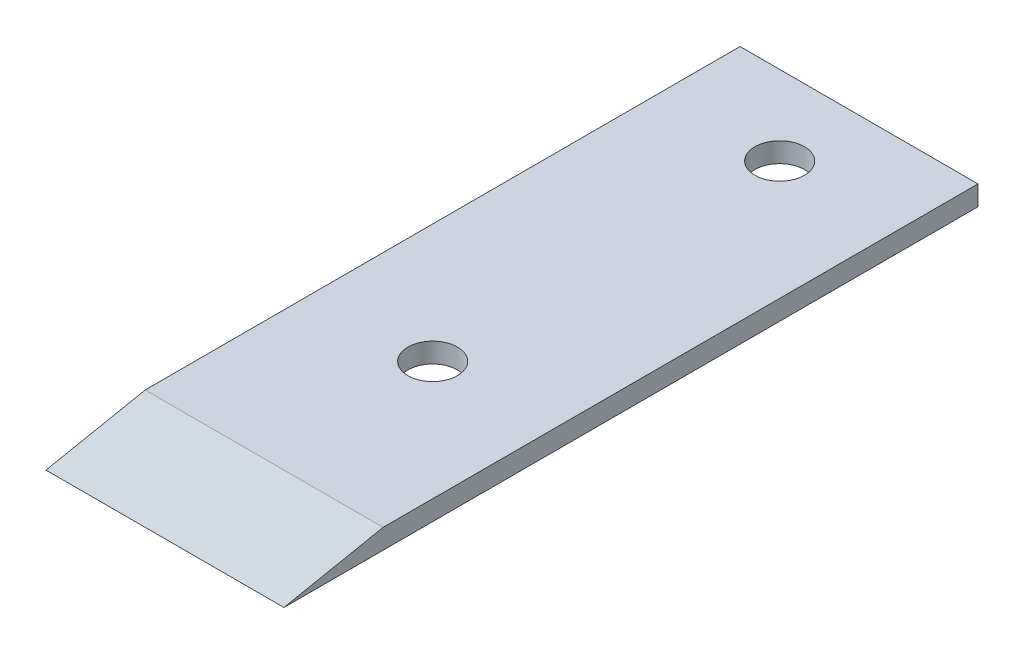
ISO-10303-21;
HEADER;
FILE_DESCRIPTION(('STEP AP214'),'2;1');
FILE_NAME('part.step','',(''),(''),'','','');
FILE_SCHEMA(('AUTOMOTIVE_DESIGN { 1 0 10303 214 1 1 1 1 }'));
ENDSEC;
DATA;
#1=APPLICATION_CONTEXT('core data for automotive mechanical design processes');
#2=APPLICATION_PROTOCOL_DEFINITION('international standard','automotive_design',2000,#1);
#3=PRODUCT_CONTEXT('',#1,'mechanical');
#4=PRODUCT('Part','Part','',(#3));
#5=PRODUCT_RELATED_PRODUCT_CATEGORY('part','',(#4));
#6=PRODUCT_DEFINITION_FORMATION('','',#4);
#7=PRODUCT_DEFINITION_CONTEXT('part definition',#1,'design');
#8=PRODUCT_DEFINITION('design','',#6,#7);
#9=PRODUCT_DEFINITION_SHAPE('','',#8);
#10=(LENGTH_UNIT() NAMED_UNIT(*) SI_UNIT(.MILLI.,.METRE.));
#11=(NAMED_UNIT(*) PLANE_ANGLE_UNIT() SI_UNIT($,.RADIAN.));
#12=(NAMED_UNIT(*) SI_UNIT($,.STERADIAN.) SOLID_ANGLE_UNIT());
#13=UNCERTAINTY_MEASURE_WITH_UNIT(LENGTH_MEASURE(1.E-05),#10,'distance_accuracy_value','');
#14=(GEOMETRIC_REPRESENTATION_CONTEXT(3) GLOBAL_UNCERTAINTY_ASSIGNED_CONTEXT((#13)) GLOBAL_UNIT_ASSIGNED_CONTEXT((#10,
#11,#12)) REPRESENTATION_CONTEXT('',''));
#15=CARTESIAN_POINT('',(0.,0.,0.));
#16=DIRECTION('',(0.,0.,1.));
#17=DIRECTION('',(1.,0.,0.));
#18=AXIS2_PLACEMENT_3D('',#15,#16,#17);
#19=CARTESIAN_POINT('',(0.,2.,0.));
#20=DIRECTION('',(0.,-1.,0.));
#21=DIRECTION('',(0.,0.,-1.));
#22=AXIS2_PLACEMENT_3D('',#19,#20,#21);
#23=PLANE('',#22);
#24=CARTESIAN_POINT('',(0.,2.,-27.));
#25=DIRECTION('',(0.,1.,0.));
#26=DIRECTION('',(0.,0.,1.));
#27=AXIS2_PLACEMENT_3D('',#24,#25,#26);
#28=CIRCLE('',#27,2.5);
#29=CARTESIAN_POINT('',(0.,2.,-24.5));
#30=VERTEX_POINT('',#29);
#31=EDGE_CURVE('E121',#30,#30,#28,.T.);
#32=ORIENTED_EDGE('',*,*,#31,.F.);
#33=EDGE_LOOP('',(#32));
#34=FACE_BOUND('',#33,.T.);
#35=CARTESIAN_POINT('',(0.,2.,8.));
#36=DIRECTION('',(0.,1.,0.));
#37=DIRECTION('',(0.,0.,1.));
#38=AXIS2_PLACEMENT_3D('',#35,#36,#37);
#39=CIRCLE('',#38,2.5);
#40=CARTESIAN_POINT('',(0.,2.,10.5));
#41=VERTEX_POINT('',#40);
#42=EDGE_CURVE('E117',#41,#41,#39,.T.);
#43=ORIENTED_EDGE('',*,*,#42,.F.);
#44=EDGE_LOOP('',(#43));
#45=FACE_BOUND('',#44,.T.);
#46=DIRECTION('',(-1.,0.,0.));
#47=VECTOR('',#46,1.);
#48=CARTESIAN_POINT('',(104.533777616609,2.,25.));
#49=LINE('',#48,#47);
#50=CARTESIAN_POINT('',(12.,2.,25.));
#51=VERTEX_POINT('',#50);
#52=CARTESIAN_POINT('',(-12.,2.,25.));
#53=VERTEX_POINT('',#52);
#54=EDGE_CURVE('E61',#51,#53,#49,.T.);
#55=ORIENTED_EDGE('',*,*,#54,.F.);
#56=DIRECTION('',(0.,0.,-1.));
#57=VECTOR('',#56,1.);
#58=CARTESIAN_POINT('',(12.,2.,35.));
#59=LINE('',#58,#57);
#60=CARTESIAN_POINT('',(12.,2.,-35.));
#61=VERTEX_POINT('',#60);
#62=EDGE_CURVE('E96',#51,#61,#59,.T.);
#63=ORIENTED_EDGE('',*,*,#62,.T.);
#64=DIRECTION('',(-1.,0.,0.));
#65=VECTOR('',#64,1.);
#66=CARTESIAN_POINT('',(-12.,2.,-35.));
#67=LINE('',#66,#65);
#68=CARTESIAN_POINT('',(-12.,2.,-35.));
#69=VERTEX_POINT('',#68);
#70=EDGE_CURVE('E130',#61,#69,#67,.T.);
#71=ORIENTED_EDGE('',*,*,#70,.T.);
#72=DIRECTION('',(0.,0.,1.));
#73=VECTOR('',#72,1.);
#74=CARTESIAN_POINT('',(-12.,2.,35.));
#75=LINE('',#74,#73);
#76=EDGE_CURVE('E133',#69,#53,#75,.T.);
#77=ORIENTED_EDGE('',*,*,#76,.T.);
#78=EDGE_LOOP('',(#55,#63,#71,#77));
#79=FACE_BOUND('',#78,.T.);
#80=ADVANCED_FACE('F45',(#34,#45,#79),#23,.F.);
#81=CARTESIAN_POINT('',(12.,2.,35.));
#82=DIRECTION('',(-1.,0.,0.));
#83=DIRECTION('',(0.,0.,1.));
#84=AXIS2_PLACEMENT_3D('',#81,#82,#83);
#85=PLANE('',#84);
#86=DIRECTION('',(0.,0.196116135138184,-0.98058067569092));
#87=VECTOR('',#86,1.);
#88=CARTESIAN_POINT('',(12.,0.0769230769230771,34.6153846153846));
#89=LINE('',#88,#87);
#90=CARTESIAN_POINT('',(12.,0.,35.));
#91=VERTEX_POINT('',#90);
#92=EDGE_CURVE('E106',#91,#51,#89,.T.);
#93=ORIENTED_EDGE('',*,*,#92,.F.);
#94=DIRECTION('',(0.,0.,-1.));
#95=VECTOR('',#94,1.);
#96=CARTESIAN_POINT('',(12.,0.,35.));
#97=LINE('',#96,#95);
#98=CARTESIAN_POINT('',(12.,0.,-35.));
#99=VERTEX_POINT('',#98);
#100=EDGE_CURVE('E92',#91,#99,#97,.T.);
#101=ORIENTED_EDGE('',*,*,#100,.T.);
#102=DIRECTION('',(0.,-1.,0.));
#103=VECTOR('',#102,1.);
#104=CARTESIAN_POINT('',(12.,2.,-35.));
#105=LINE('',#104,#103);
#106=EDGE_CURVE('E54',#61,#99,#105,.T.);
#107=ORIENTED_EDGE('',*,*,#106,.F.);
#108=ORIENTED_EDGE('',*,*,#62,.F.);
#109=EDGE_LOOP('',(#93,#101,#107,#108));
#110=FACE_BOUND('',#109,.T.);
#111=ADVANCED_FACE('F47',(#110),#85,.F.);
#112=CARTESIAN_POINT('',(-12.,2.,35.));
#113=DIRECTION('',(1.,0.,0.));
#114=DIRECTION('',(0.,0.,-1.));
#115=AXIS2_PLACEMENT_3D('',#112,#113,#114);
#116=PLANE('',#115);
#117=DIRECTION('',(0.,-0.196116135138184,0.98058067569092));
#118=VECTOR('',#117,1.);
#119=CARTESIAN_POINT('',(-12.,0.0769230769230771,34.6153846153846));
#120=LINE('',#119,#118);
#121=CARTESIAN_POINT('',(-12.,0.,35.));
#122=VERTEX_POINT('',#121);
#123=EDGE_CURVE('E11',#53,#122,#120,.T.);
#124=ORIENTED_EDGE('',*,*,#123,.F.);
#125=ORIENTED_EDGE('',*,*,#76,.F.);
#126=DIRECTION('',(0.,-1.,0.));
#127=VECTOR('',#126,1.);
#128=CARTESIAN_POINT('',(-12.,2.,-35.));
#129=LINE('',#128,#127);
#130=CARTESIAN_POINT('',(-12.,0.,-35.));
#131=VERTEX_POINT('',#130);
#132=EDGE_CURVE('E101',#69,#131,#129,.T.);
#133=ORIENTED_EDGE('',*,*,#132,.T.);
#134=DIRECTION('',(0.,0.,1.));
#135=VECTOR('',#134,1.);
#136=CARTESIAN_POINT('',(-12.,0.,35.));
#137=LINE('',#136,#135);
#138=EDGE_CURVE('E90',#131,#122,#137,.T.);
#139=ORIENTED_EDGE('',*,*,#138,.T.);
#140=EDGE_LOOP('',(#124,#125,#133,#139));
#141=FACE_BOUND('',#140,.T.);
#142=ADVANCED_FACE('F99',(#141),#116,.F.);
#143=CARTESIAN_POINT('',(-12.,2.,-35.));
#144=DIRECTION('',(0.,0.,1.));
#145=DIRECTION('',(1.,0.,0.));
#146=AXIS2_PLACEMENT_3D('',#143,#144,#145);
#147=PLANE('',#146);
#148=DIRECTION('',(-1.,0.,0.));
#149=VECTOR('',#148,1.);
#150=CARTESIAN_POINT('',(-12.,0.,-35.));
#151=LINE('',#150,#149);
#152=EDGE_CURVE('E103',#99,#131,#151,.T.);
#153=ORIENTED_EDGE('',*,*,#152,.T.);
#154=ORIENTED_EDGE('',*,*,#132,.F.);
#155=ORIENTED_EDGE('',*,*,#70,.F.);
#156=ORIENTED_EDGE('',*,*,#106,.T.);
#157=EDGE_LOOP('',(#153,#154,#155,#156));
#158=FACE_BOUND('',#157,.T.);
#159=ADVANCED_FACE('F146',(#158),#147,.F.);
#160=CARTESIAN_POINT('',(0.,0.,0.));
#161=DIRECTION('',(0.,-1.,0.));
#162=DIRECTION('',(0.,0.,-1.));
#163=AXIS2_PLACEMENT_3D('',#160,#161,#162);
#164=PLANE('',#163);
#165=CARTESIAN_POINT('',(0.,0.,8.));
#166=DIRECTION('',(0.,1.,0.));
#167=DIRECTION('',(0.,0.,1.));
#168=AXIS2_PLACEMENT_3D('',#165,#166,#167);
#169=CIRCLE('',#168,2.5);
#170=CARTESIAN_POINT('',(0.,0.,10.5));
#171=VERTEX_POINT('',#170);
#172=EDGE_CURVE('E113',#171,#171,#169,.T.);
#173=ORIENTED_EDGE('',*,*,#172,.T.);
#174=EDGE_LOOP('',(#173));
#175=FACE_BOUND('',#174,.T.);
#176=CARTESIAN_POINT('',(0.,0.,-27.));
#177=DIRECTION('',(0.,1.,0.));
#178=DIRECTION('',(0.,0.,1.));
#179=AXIS2_PLACEMENT_3D('',#176,#177,#178);
#180=CIRCLE('',#179,2.5);
#181=CARTESIAN_POINT('',(0.,0.,-24.5));
#182=VERTEX_POINT('',#181);
#183=EDGE_CURVE('E110',#182,#182,#180,.T.);
#184=ORIENTED_EDGE('',*,*,#183,.T.);
#185=EDGE_LOOP('',(#184));
#186=FACE_BOUND('',#185,.T.);
#187=ORIENTED_EDGE('',*,*,#100,.F.);
#188=DIRECTION('',(1.,0.,0.));
#189=VECTOR('',#188,1.);
#190=CARTESIAN_POINT('',(-12.,0.,35.));
#191=LINE('',#190,#189);
#192=EDGE_CURVE('E88',#122,#91,#191,.T.);
#193=ORIENTED_EDGE('',*,*,#192,.F.);
#194=ORIENTED_EDGE('',*,*,#138,.F.);
#195=ORIENTED_EDGE('',*,*,#152,.F.);
#196=EDGE_LOOP('',(#187,#193,#194,#195));
#197=FACE_BOUND('',#196,.T.);
#198=ADVANCED_FACE('F89',(#175,#186,#197),#164,.T.);
#199=CARTESIAN_POINT('',(0.,0.,-27.));
#200=DIRECTION('',(0.,1.,0.));
#201=DIRECTION('',(0.,0.,1.));
#202=AXIS2_PLACEMENT_3D('',#199,#200,#201);
#203=CYLINDRICAL_SURFACE('',#202,2.5);
#204=ORIENTED_EDGE('',*,*,#183,.F.);
#205=EDGE_LOOP('',(#204));
#206=FACE_BOUND('',#205,.T.);
#207=ORIENTED_EDGE('',*,*,#31,.T.);
#208=EDGE_LOOP('',(#207));
#209=FACE_BOUND('',#208,.T.);
#210=ADVANCED_FACE('F159',(#206,#209),#203,.F.);
#211=CARTESIAN_POINT('',(0.,0.,8.));
#212=DIRECTION('',(0.,1.,0.));
#213=DIRECTION('',(0.,0.,1.));
#214=AXIS2_PLACEMENT_3D('',#211,#212,#213);
#215=CYLINDRICAL_SURFACE('',#214,2.5);
#216=ORIENTED_EDGE('',*,*,#172,.F.);
#217=EDGE_LOOP('',(#216));
#218=FACE_BOUND('',#217,.T.);
#219=ORIENTED_EDGE('',*,*,#42,.T.);
#220=EDGE_LOOP('',(#219));
#221=FACE_BOUND('',#220,.T.);
#222=ADVANCED_FACE('F175',(#218,#221),#215,.F.);
#223=CARTESIAN_POINT('',(104.533777616609,0.,35.));
#224=DIRECTION('',(0.,0.98058067569092,0.196116135138184));
#225=DIRECTION('',(0.,-0.196116135138184,0.98058067569092));
#226=AXIS2_PLACEMENT_3D('',#223,#224,#225);
#227=PLANE('',#226);
#228=ORIENTED_EDGE('',*,*,#192,.T.);
#229=ORIENTED_EDGE('',*,*,#92,.T.);
#230=ORIENTED_EDGE('',*,*,#54,.T.);
#231=ORIENTED_EDGE('',*,*,#123,.T.);
#232=EDGE_LOOP('',(#228,#229,#230,#231));
#233=FACE_BOUND('',#232,.T.);
#234=ADVANCED_FACE('F105',(#233),#227,.T.);
#235=CLOSED_SHELL('',(#80,#111,#142,#159,#198,#210,#222,#234));
#236=MANIFOLD_SOLID_BREP('B2',#235);
#237=ADVANCED_BREP_SHAPE_REPRESENTATION('',(#18,#236),#14);
#238=SHAPE_DEFINITION_REPRESENTATION(#9,#237);
ENDSEC;
END-ISO-10303-21;
